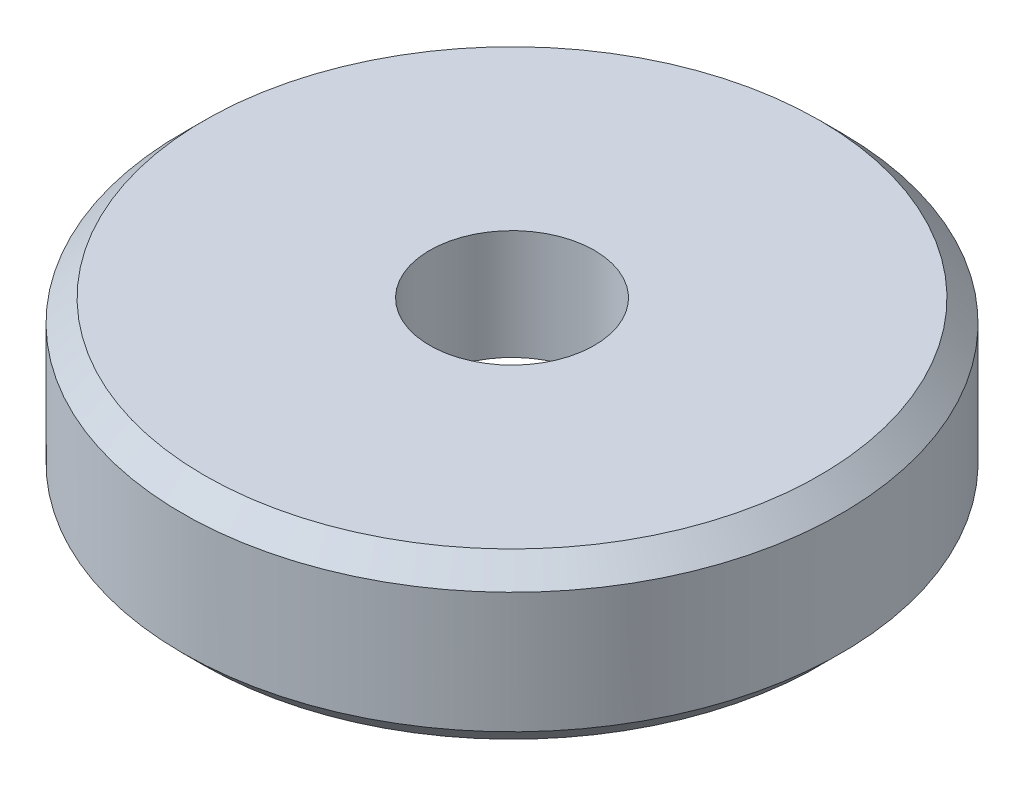
ISO-10303-21;
HEADER;
FILE_DESCRIPTION(('STEP AP214'),'2;1');
FILE_NAME('part.step','',(''),(''),'','','');
FILE_SCHEMA(('AUTOMOTIVE_DESIGN { 1 0 10303 214 1 1 1 1 }'));
ENDSEC;
DATA;
#1=APPLICATION_CONTEXT('core data for automotive mechanical design processes');
#2=APPLICATION_PROTOCOL_DEFINITION('international standard','automotive_design',2000,#1);
#3=PRODUCT_CONTEXT('',#1,'mechanical');
#4=PRODUCT('Part','Part','',(#3));
#5=PRODUCT_RELATED_PRODUCT_CATEGORY('part','',(#4));
#6=PRODUCT_DEFINITION_FORMATION('','',#4);
#7=PRODUCT_DEFINITION_CONTEXT('part definition',#1,'design');
#8=PRODUCT_DEFINITION('design','',#6,#7);
#9=PRODUCT_DEFINITION_SHAPE('','',#8);
#10=(LENGTH_UNIT() NAMED_UNIT(*) SI_UNIT(.MILLI.,.METRE.));
#11=(NAMED_UNIT(*) PLANE_ANGLE_UNIT() SI_UNIT($,.RADIAN.));
#12=(NAMED_UNIT(*) SI_UNIT($,.STERADIAN.) SOLID_ANGLE_UNIT());
#13=UNCERTAINTY_MEASURE_WITH_UNIT(LENGTH_MEASURE(1.E-05),#10,'distance_accuracy_value','');
#14=(GEOMETRIC_REPRESENTATION_CONTEXT(3) GLOBAL_UNCERTAINTY_ASSIGNED_CONTEXT((#13)) GLOBAL_UNIT_ASSIGNED_CONTEXT((#10,
#11,#12)) REPRESENTATION_CONTEXT('',''));
#15=CARTESIAN_POINT('',(0.,0.,0.));
#16=DIRECTION('',(0.,0.,1.));
#17=DIRECTION('',(1.,0.,0.));
#18=AXIS2_PLACEMENT_3D('',#15,#16,#17);
#19=CARTESIAN_POINT('',(0.,19.05,0.));
#20=DIRECTION('',(0.,-1.,0.));
#21=DIRECTION('',(0.,0.,-1.));
#22=AXIS2_PLACEMENT_3D('',#19,#20,#21);
#23=CYLINDRICAL_SURFACE('',#22,9.525);
#24=CARTESIAN_POINT('',(0.,19.05,0.));
#25=DIRECTION('',(0.,1.,0.));
#26=DIRECTION('',(0.,0.,1.));
#27=AXIS2_PLACEMENT_3D('',#24,#25,#26);
#28=CIRCLE('',#27,9.525);
#29=CARTESIAN_POINT('',(0.,19.05,-9.525));
#30=VERTEX_POINT('',#29);
#31=EDGE_CURVE('E71',#30,#30,#28,.T.);
#32=CARTESIAN_POINT('',(0.,6.35,0.));
#33=DIRECTION('',(0.,-1.,0.));
#34=DIRECTION('',(0.,0.,-1.));
#35=AXIS2_PLACEMENT_3D('',#32,#33,#34);
#36=CIRCLE('',#35,9.525);
#37=CARTESIAN_POINT('',(0.,6.35,-9.525));
#38=VERTEX_POINT('',#37);
#39=EDGE_CURVE('E50',#38,#38,#36,.T.);
#40=CARTESIAN_POINT('',(0.,19.05,-9.525));
#41=CARTESIAN_POINT('',(0.,18.9177083333333,-9.525));
#42=CARTESIAN_POINT('',(0.,18.7854166666667,-9.525));
#43=CARTESIAN_POINT('',(0.,18.5208333333333,-9.525));
#44=CARTESIAN_POINT('',(0.,18.3885416666667,-9.525));
#45=CARTESIAN_POINT('',(0.,18.1239583333333,-9.525));
#46=CARTESIAN_POINT('',(0.,17.9916666666667,-9.525));
#47=CARTESIAN_POINT('',(0.,17.7270833333333,-9.525));
#48=CARTESIAN_POINT('',(0.,17.5947916666667,-9.525));
#49=CARTESIAN_POINT('',(0.,17.3302083333333,-9.525));
#50=CARTESIAN_POINT('',(0.,17.1979166666667,-9.525));
#51=CARTESIAN_POINT('',(0.,16.9333333333333,-9.525));
#52=CARTESIAN_POINT('',(0.,16.8010416666667,-9.525));
#53=CARTESIAN_POINT('',(0.,16.5364583333333,-9.525));
#54=CARTESIAN_POINT('',(0.,16.4041666666667,-9.525));
#55=CARTESIAN_POINT('',(0.,16.1395833333333,-9.525));
#56=CARTESIAN_POINT('',(0.,16.0072916666667,-9.525));
#57=CARTESIAN_POINT('',(0.,15.7427083333333,-9.525));
#58=CARTESIAN_POINT('',(0.,15.6104166666667,-9.525));
#59=CARTESIAN_POINT('',(0.,15.3458333333333,-9.525));
#60=CARTESIAN_POINT('',(0.,15.2135416666667,-9.525));
#61=CARTESIAN_POINT('',(0.,14.9489583333333,-9.525));
#62=CARTESIAN_POINT('',(0.,14.8166666666667,-9.525));
#63=CARTESIAN_POINT('',(0.,14.5520833333333,-9.525));
#64=CARTESIAN_POINT('',(0.,14.4197916666667,-9.525));
#65=CARTESIAN_POINT('',(0.,14.1552083333333,-9.525));
#66=CARTESIAN_POINT('',(0.,14.0229166666667,-9.525));
#67=CARTESIAN_POINT('',(0.,13.7583333333333,-9.525));
#68=CARTESIAN_POINT('',(0.,13.6260416666667,-9.525));
#69=CARTESIAN_POINT('',(0.,13.3614583333333,-9.525));
#70=CARTESIAN_POINT('',(0.,13.2291666666667,-9.525));
#71=CARTESIAN_POINT('',(0.,12.9645833333333,-9.525));
#72=CARTESIAN_POINT('',(0.,12.8322916666667,-9.525));
#73=CARTESIAN_POINT('',(0.,12.5677083333333,-9.525));
#74=CARTESIAN_POINT('',(0.,12.4354166666667,-9.525));
#75=CARTESIAN_POINT('',(0.,12.1708333333333,-9.525));
#76=CARTESIAN_POINT('',(0.,12.0385416666667,-9.525));
#77=CARTESIAN_POINT('',(0.,11.7739583333333,-9.525));
#78=CARTESIAN_POINT('',(0.,11.6416666666667,-9.525));
#79=CARTESIAN_POINT('',(0.,11.3770833333333,-9.525));
#80=CARTESIAN_POINT('',(0.,11.2447916666667,-9.525));
#81=CARTESIAN_POINT('',(0.,10.9802083333333,-9.525));
#82=CARTESIAN_POINT('',(0.,10.8479166666667,-9.525));
#83=CARTESIAN_POINT('',(0.,10.5833333333333,-9.525));
#84=CARTESIAN_POINT('',(0.,10.4510416666667,-9.525));
#85=CARTESIAN_POINT('',(0.,10.1864583333333,-9.525));
#86=CARTESIAN_POINT('',(0.,10.0541666666667,-9.525));
#87=CARTESIAN_POINT('',(0.,9.78958333333333,-9.525));
#88=CARTESIAN_POINT('',(0.,9.65729166666667,-9.525));
#89=CARTESIAN_POINT('',(0.,9.39270833333333,-9.525));
#90=CARTESIAN_POINT('',(0.,9.26041666666667,-9.525));
#91=CARTESIAN_POINT('',(0.,8.99583333333333,-9.525));
#92=CARTESIAN_POINT('',(0.,8.86354166666667,-9.525));
#93=CARTESIAN_POINT('',(0.,8.59895833333333,-9.525));
#94=CARTESIAN_POINT('',(0.,8.46666666666667,-9.525));
#95=CARTESIAN_POINT('',(0.,8.20208333333333,-9.525));
#96=CARTESIAN_POINT('',(0.,8.06979166666667,-9.525));
#97=CARTESIAN_POINT('',(0.,7.80520833333333,-9.525));
#98=CARTESIAN_POINT('',(0.,7.67291666666667,-9.525));
#99=CARTESIAN_POINT('',(0.,7.40833333333333,-9.525));
#100=CARTESIAN_POINT('',(0.,7.27604166666667,-9.525));
#101=CARTESIAN_POINT('',(0.,7.01145833333333,-9.525));
#102=CARTESIAN_POINT('',(0.,6.87916666666667,-9.525));
#103=CARTESIAN_POINT('',(0.,6.61458333333333,-9.525));
#104=CARTESIAN_POINT('',(0.,6.48229166666667,-9.525));
#105=CARTESIAN_POINT('',(0.,6.35,-9.525));
#106=B_SPLINE_CURVE_WITH_KNOTS('',3,(#40,#41,#42,#43,#44,#45,#46,#47,#48,#49,#50,#51,#52,#53,
#54,#55,#56,#57,#58,#59,#60,#61,#62,#63,#64,#65,#66,#67,#68,#69,#70,#71,#72,#73,#74,#75,#76,#77,
#78,#79,#80,#81,#82,#83,#84,#85,#86,#87,#88,#89,#90,#91,#92,#93,#94,#95,#96,#97,#98,#99,#100,
#101,#102,#103,#104,#105),.UNSPECIFIED.,.F.,.F.,(4,2,2,2,2,2,2,2,2,2,2,2,2,2,2,2,2,2,2,2,2,2,2,
2,2,2,2,2,2,2,2,2,4),(0.,0.396874999999998,0.793749999999999,1.190625,1.5875,1.984375,2.38125,
2.778125,3.175,3.571875,3.96875,4.365625,4.7625,5.159375,5.55625,5.953125,6.35,6.746875,7.14375,
7.540625,7.9375,8.334375,8.73125,9.128125,9.525,9.921875,10.31875,10.715625,11.1125,11.509375,
11.90625,12.303125,12.7),.UNSPECIFIED.);
#107=EDGE_CURVE('BSEAM45',#30,#38,#106,.T.);
#108=ORIENTED_EDGE('',*,*,#31,.T.);
#109=ORIENTED_EDGE('',*,*,#39,.T.);
#110=ORIENTED_EDGE('',*,*,#107,.T.);
#111=ORIENTED_EDGE('',*,*,#107,.F.);
#112=EDGE_LOOP('',(#108,#110,#109,#111));
#113=FACE_BOUND('',#112,.T.);
#114=ADVANCED_FACE('F45',(#113),#23,.F.);
#115=CARTESIAN_POINT('',(0.,19.05,0.));
#116=DIRECTION('',(0.,1.,0.));
#117=DIRECTION('',(0.,0.,1.));
#118=AXIS2_PLACEMENT_3D('',#115,#116,#117);
#119=PLANE('',#118);
#120=CARTESIAN_POINT('',(0.,19.05,0.));
#121=DIRECTION('',(0.,1.,0.));
#122=DIRECTION('',(0.,0.,1.));
#123=AXIS2_PLACEMENT_3D('',#120,#121,#122);
#124=CIRCLE('',#123,35.5600000000001);
#125=CARTESIAN_POINT('',(0.,19.05,35.5600000000001));
#126=VERTEX_POINT('',#125);
#127=EDGE_CURVE('E10',#126,#126,#124,.T.);
#128=ORIENTED_EDGE('',*,*,#127,.T.);
#129=EDGE_LOOP('',(#128));
#130=FACE_BOUND('',#129,.T.);
#131=ORIENTED_EDGE('',*,*,#31,.F.);
#132=EDGE_LOOP('',(#131));
#133=FACE_BOUND('',#132,.T.);
#134=ADVANCED_FACE('F101',(#130,#133),#119,.T.);
#135=CARTESIAN_POINT('',(0.,0.,0.));
#136=DIRECTION('',(0.,1.,0.));
#137=DIRECTION('',(0.,0.,1.));
#138=AXIS2_PLACEMENT_3D('',#135,#136,#137);
#139=PLANE('',#138);
#140=CARTESIAN_POINT('',(0.,0.,0.));
#141=DIRECTION('',(0.,-1.,0.));
#142=DIRECTION('',(0.,0.,-1.));
#143=AXIS2_PLACEMENT_3D('',#140,#141,#142);
#144=CIRCLE('',#143,25.4);
#145=CARTESIAN_POINT('',(0.,0.,-25.4));
#146=VERTEX_POINT('',#145);
#147=EDGE_CURVE('E75',#146,#146,#144,.T.);
#148=ORIENTED_EDGE('',*,*,#147,.F.);
#149=EDGE_LOOP('',(#148));
#150=FACE_BOUND('',#149,.T.);
#151=CARTESIAN_POINT('',(0.,0.,0.));
#152=DIRECTION('',(0.,1.,0.));
#153=DIRECTION('',(0.,0.,1.));
#154=AXIS2_PLACEMENT_3D('',#151,#152,#153);
#155=CIRCLE('',#154,35.56);
#156=CARTESIAN_POINT('',(0.,0.,35.56));
#157=VERTEX_POINT('',#156);
#158=EDGE_CURVE('E55',#157,#157,#155,.F.);
#159=ORIENTED_EDGE('',*,*,#158,.T.);
#160=EDGE_LOOP('',(#159));
#161=FACE_BOUND('',#160,.T.);
#162=ADVANCED_FACE('F107',(#150,#161),#139,.F.);
#163=CARTESIAN_POINT('',(0.,19.05,0.));
#164=DIRECTION('',(0.,-1.,0.));
#165=DIRECTION('',(0.,0.,-1.));
#166=AXIS2_PLACEMENT_3D('',#163,#164,#165);
#167=CYLINDRICAL_SURFACE('',#166,38.1);
#168=CARTESIAN_POINT('',(0.,2.54000000000004,0.));
#169=DIRECTION('',(0.,1.,0.));
#170=DIRECTION('',(0.,0.,1.));
#171=AXIS2_PLACEMENT_3D('',#168,#169,#170);
#172=CIRCLE('',#171,38.1);
#173=CARTESIAN_POINT('',(0.,2.54000000000004,-38.1));
#174=VERTEX_POINT('',#173);
#175=EDGE_CURVE('E61',#174,#174,#172,.T.);
#176=CARTESIAN_POINT('',(0.,16.51,0.));
#177=DIRECTION('',(0.,1.,0.));
#178=DIRECTION('',(0.,0.,1.));
#179=AXIS2_PLACEMENT_3D('',#176,#177,#178);
#180=CIRCLE('',#179,38.1);
#181=CARTESIAN_POINT('',(0.,16.51,-38.1));
#182=VERTEX_POINT('',#181);
#183=EDGE_CURVE('E67',#182,#182,#180,.F.);
#184=CARTESIAN_POINT('',(0.,2.54000000000004,-38.1));
#185=CARTESIAN_POINT('',(0.,2.68552083333338,-38.1));
#186=CARTESIAN_POINT('',(0.,2.83104166666671,-38.1));
#187=CARTESIAN_POINT('',(0.,3.12208333333338,-38.1));
#188=CARTESIAN_POINT('',(0.,3.26760416666671,-38.1));
#189=CARTESIAN_POINT('',(0.,3.55864583333337,-38.1));
#190=CARTESIAN_POINT('',(0.,3.70416666666671,-38.1));
#191=CARTESIAN_POINT('',(0.,3.99520833333337,-38.1));
#192=CARTESIAN_POINT('',(0.,4.14072916666671,-38.1));
#193=CARTESIAN_POINT('',(0.,4.43177083333337,-38.1));
#194=CARTESIAN_POINT('',(0.,4.57729166666671,-38.1));
#195=CARTESIAN_POINT('',(0.,4.86833333333337,-38.1));
#196=CARTESIAN_POINT('',(0.,5.01385416666671,-38.1));
#197=CARTESIAN_POINT('',(0.,5.30489583333338,-38.1));
#198=CARTESIAN_POINT('',(0.,5.45041666666671,-38.1));
#199=CARTESIAN_POINT('',(0.,5.74145833333337,-38.1));
#200=CARTESIAN_POINT('',(0.,5.88697916666671,-38.1));
#201=CARTESIAN_POINT('',(0.,6.17802083333338,-38.1));
#202=CARTESIAN_POINT('',(0.,6.32354166666671,-38.1));
#203=CARTESIAN_POINT('',(0.,6.61458333333338,-38.1));
#204=CARTESIAN_POINT('',(0.,6.76010416666671,-38.1));
#205=CARTESIAN_POINT('',(0.,7.05114583333338,-38.1));
#206=CARTESIAN_POINT('',(0.,7.19666666666671,-38.1));
#207=CARTESIAN_POINT('',(0.,7.48770833333338,-38.1));
#208=CARTESIAN_POINT('',(0.,7.63322916666671,-38.1));
#209=CARTESIAN_POINT('',(0.,7.92427083333338,-38.1));
#210=CARTESIAN_POINT('',(0.,8.06979166666671,-38.1));
#211=CARTESIAN_POINT('',(0.,8.36083333333338,-38.1));
#212=CARTESIAN_POINT('',(0.,8.50635416666671,-38.1));
#213=CARTESIAN_POINT('',(0.,8.79739583333338,-38.1));
#214=CARTESIAN_POINT('',(0.,8.94291666666671,-38.1));
#215=CARTESIAN_POINT('',(0.,9.23395833333338,-38.1));
#216=CARTESIAN_POINT('',(0.,9.37947916666671,-38.1));
#217=CARTESIAN_POINT('',(0.,9.67052083333338,-38.1));
#218=CARTESIAN_POINT('',(0.,9.81604166666671,-38.1));
#219=CARTESIAN_POINT('',(0.,10.1070833333334,-38.1));
#220=CARTESIAN_POINT('',(0.,10.2526041666667,-38.1));
#221=CARTESIAN_POINT('',(0.,10.5436458333334,-38.1));
#222=CARTESIAN_POINT('',(0.,10.6891666666667,-38.1));
#223=CARTESIAN_POINT('',(0.,10.9802083333334,-38.1));
#224=CARTESIAN_POINT('',(0.,11.1257291666667,-38.1));
#225=CARTESIAN_POINT('',(0.,11.4167708333334,-38.1));
#226=CARTESIAN_POINT('',(0.,11.5622916666667,-38.1));
#227=CARTESIAN_POINT('',(0.,11.8533333333334,-38.1));
#228=CARTESIAN_POINT('',(0.,11.9988541666667,-38.1));
#229=CARTESIAN_POINT('',(0.,12.2898958333334,-38.1));
#230=CARTESIAN_POINT('',(0.,12.4354166666667,-38.1));
#231=CARTESIAN_POINT('',(0.,12.7264583333334,-38.1));
#232=CARTESIAN_POINT('',(0.,12.8719791666667,-38.1));
#233=CARTESIAN_POINT('',(0.,13.1630208333334,-38.1));
#234=CARTESIAN_POINT('',(0.,13.3085416666667,-38.1));
#235=CARTESIAN_POINT('',(0.,13.5995833333334,-38.1));
#236=CARTESIAN_POINT('',(0.,13.7451041666667,-38.1));
#237=CARTESIAN_POINT('',(0.,14.0361458333334,-38.1));
#238=CARTESIAN_POINT('',(0.,14.1816666666667,-38.1));
#239=CARTESIAN_POINT('',(0.,14.4727083333334,-38.1));
#240=CARTESIAN_POINT('',(0.,14.6182291666667,-38.1));
#241=CARTESIAN_POINT('',(0.,14.9092708333334,-38.1));
#242=CARTESIAN_POINT('',(0.,15.0547916666667,-38.1));
#243=CARTESIAN_POINT('',(0.,15.3458333333334,-38.1));
#244=CARTESIAN_POINT('',(0.,15.4913541666667,-38.1));
#245=CARTESIAN_POINT('',(0.,15.7823958333334,-38.1));
#246=CARTESIAN_POINT('',(0.,15.9279166666667,-38.1));
#247=CARTESIAN_POINT('',(0.,16.2189583333334,-38.1));
#248=CARTESIAN_POINT('',(0.,16.3644791666667,-38.1));
#249=CARTESIAN_POINT('',(0.,16.51,-38.1));
#250=B_SPLINE_CURVE_WITH_KNOTS('',3,(#184,#185,#186,#187,#188,#189,#190,#191,#192,#193,#194,
#195,#196,#197,#198,#199,#200,#201,#202,#203,#204,#205,#206,#207,#208,#209,#210,#211,#212,#213,
#214,#215,#216,#217,#218,#219,#220,#221,#222,#223,#224,#225,#226,#227,#228,#229,#230,#231,#232,
#233,#234,#235,#236,#237,#238,#239,#240,#241,#242,#243,#244,#245,#246,#247,#248,#249),
.UNSPECIFIED.,.F.,.F.,(4,2,2,2,2,2,2,2,2,2,2,2,2,2,2,2,2,2,2,2,2,2,2,2,2,2,2,2,2,2,2,2,4),(0.,
0.436562500000001,0.873124999999999,1.3096875,1.74625,2.1828125,2.619375,3.0559375,3.4925,
3.9290625,4.365625,4.8021875,5.23875,5.6753125,6.111875,6.5484375,6.985,7.4215625,7.858125,
8.2946875,8.73125,9.1678125,9.604375,10.0409375,10.4775,10.9140625,11.350625,11.7871875,
12.22375,12.6603125,13.096875,13.5334375,13.97),.UNSPECIFIED.);
#251=EDGE_CURVE('BSEAM112',#174,#182,#250,.T.);
#252=ORIENTED_EDGE('',*,*,#175,.T.);
#253=ORIENTED_EDGE('',*,*,#183,.T.);
#254=ORIENTED_EDGE('',*,*,#251,.T.);
#255=ORIENTED_EDGE('',*,*,#251,.F.);
#256=EDGE_LOOP('',(#252,#254,#253,#255));
#257=FACE_BOUND('',#256,.T.);
#258=ADVANCED_FACE('F112',(#257),#167,.T.);
#259=CARTESIAN_POINT('',(0.,2.54000000000004,0.));
#260=DIRECTION('',(0.,1.,0.));
#261=DIRECTION('',(0.,0.,1.));
#262=AXIS2_PLACEMENT_3D('',#259,#260,#261);
#263=CONICAL_SURFACE('',#262,38.1,0.78539816339745);
#264=ORIENTED_EDGE('',*,*,#158,.F.);
#265=EDGE_LOOP('',(#264));
#266=FACE_BOUND('',#265,.T.);
#267=ORIENTED_EDGE('',*,*,#175,.F.);
#268=EDGE_LOOP('',(#267));
#269=FACE_BOUND('',#268,.T.);
#270=ADVANCED_FACE('F115',(#266,#269),#263,.T.);
#271=CARTESIAN_POINT('',(0.,19.05,0.));
#272=DIRECTION('',(0.,-1.,0.));
#273=DIRECTION('',(0.,0.,-1.));
#274=AXIS2_PLACEMENT_3D('',#271,#272,#273);
#275=CONICAL_SURFACE('',#274,35.5600000000001,0.785398163397447);
#276=ORIENTED_EDGE('',*,*,#183,.F.);
#277=EDGE_LOOP('',(#276));
#278=FACE_BOUND('',#277,.T.);
#279=ORIENTED_EDGE('',*,*,#127,.F.);
#280=EDGE_LOOP('',(#279));
#281=FACE_BOUND('',#280,.T.);
#282=ADVANCED_FACE('F48',(#278,#281),#275,.T.);
#283=CARTESIAN_POINT('',(0.,6.35,0.));
#284=DIRECTION('',(0.,-1.,0.));
#285=DIRECTION('',(0.,0.,-1.));
#286=AXIS2_PLACEMENT_3D('',#283,#284,#285);
#287=CYLINDRICAL_SURFACE('',#286,25.4);
#288=CARTESIAN_POINT('',(0.,6.35,0.));
#289=DIRECTION('',(0.,-1.,0.));
#290=DIRECTION('',(0.,0.,-1.));
#291=AXIS2_PLACEMENT_3D('',#288,#289,#290);
#292=CIRCLE('',#291,25.4);
#293=CARTESIAN_POINT('',(0.,6.35,-25.4));
#294=VERTEX_POINT('',#293);
#295=EDGE_CURVE('E79',#294,#294,#292,.T.);
#296=ORIENTED_EDGE('',*,*,#295,.F.);
#297=EDGE_LOOP('',(#296));
#298=FACE_BOUND('',#297,.T.);
#299=ORIENTED_EDGE('',*,*,#147,.T.);
#300=EDGE_LOOP('',(#299));
#301=FACE_BOUND('',#300,.T.);
#302=ADVANCED_FACE('F93',(#298,#301),#287,.F.);
#303=CARTESIAN_POINT('',(0.,6.35,0.));
#304=DIRECTION('',(0.,-1.,0.));
#305=DIRECTION('',(0.,0.,-1.));
#306=AXIS2_PLACEMENT_3D('',#303,#304,#305);
#307=PLANE('',#306);
#308=ORIENTED_EDGE('',*,*,#39,.F.);
#309=EDGE_LOOP('',(#308));
#310=FACE_BOUND('',#309,.T.);
#311=ORIENTED_EDGE('',*,*,#295,.T.);
#312=EDGE_LOOP('',(#311));
#313=FACE_BOUND('',#312,.T.);
#314=ADVANCED_FACE('F91',(#310,#313),#307,.T.);
#315=CLOSED_SHELL('',(#114,#134,#162,#258,#270,#282,#302,#314));
#316=MANIFOLD_SOLID_BREP('B2',#315);
#317=ADVANCED_BREP_SHAPE_REPRESENTATION('',(#18,#316),#14);
#318=SHAPE_DEFINITION_REPRESENTATION(#9,#317);
ENDSEC;
END-ISO-10303-21;
